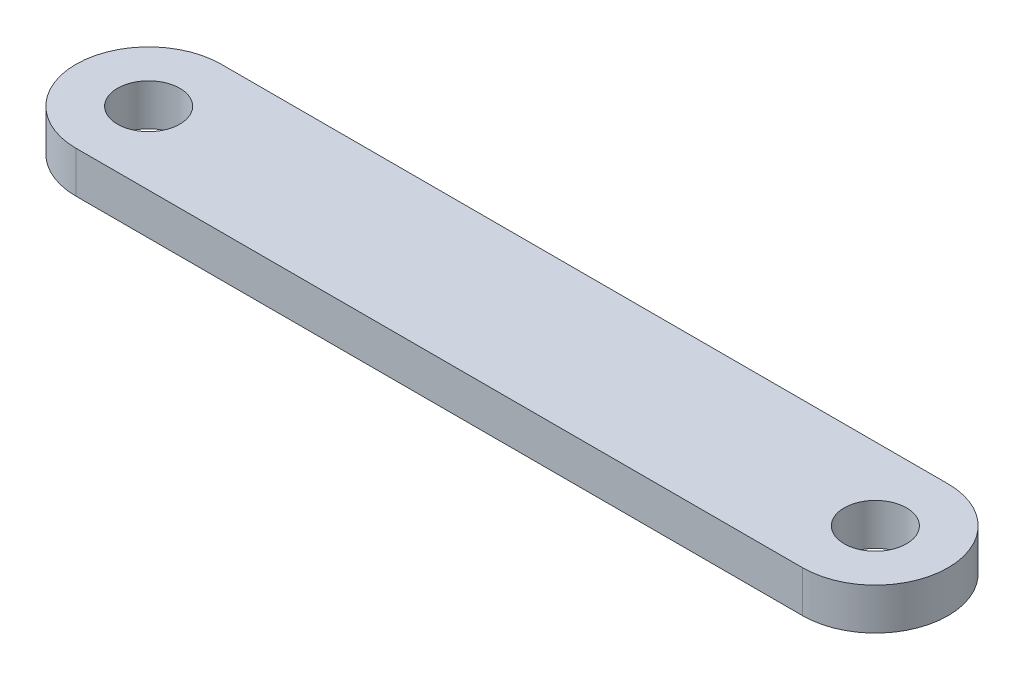
ISO-10303-21;
HEADER;
FILE_DESCRIPTION(('STEP AP214'),'2;1');
FILE_NAME('part.step','',(''),(''),'','','');
FILE_SCHEMA(('AUTOMOTIVE_DESIGN { 1 0 10303 214 1 1 1 1 }'));
ENDSEC;
DATA;
#1=APPLICATION_CONTEXT('core data for automotive mechanical design processes');
#2=APPLICATION_PROTOCOL_DEFINITION('international standard','automotive_design',2000,#1);
#3=PRODUCT_CONTEXT('',#1,'mechanical');
#4=PRODUCT('Part','Part','',(#3));
#5=PRODUCT_RELATED_PRODUCT_CATEGORY('part','',(#4));
#6=PRODUCT_DEFINITION_FORMATION('','',#4);
#7=PRODUCT_DEFINITION_CONTEXT('part definition',#1,'design');
#8=PRODUCT_DEFINITION('design','',#6,#7);
#9=PRODUCT_DEFINITION_SHAPE('','',#8);
#10=(LENGTH_UNIT() NAMED_UNIT(*) SI_UNIT(.MILLI.,.METRE.));
#11=(NAMED_UNIT(*) PLANE_ANGLE_UNIT() SI_UNIT($,.RADIAN.));
#12=(NAMED_UNIT(*) SI_UNIT($,.STERADIAN.) SOLID_ANGLE_UNIT());
#13=UNCERTAINTY_MEASURE_WITH_UNIT(LENGTH_MEASURE(1.E-05),#10,'distance_accuracy_value','');
#14=(GEOMETRIC_REPRESENTATION_CONTEXT(3) GLOBAL_UNCERTAINTY_ASSIGNED_CONTEXT((#13)) GLOBAL_UNIT_ASSIGNED_CONTEXT((#10,
#11,#12)) REPRESENTATION_CONTEXT('',''));
#15=CARTESIAN_POINT('',(0.,0.,0.));
#16=DIRECTION('',(0.,0.,1.));
#17=DIRECTION('',(1.,0.,0.));
#18=AXIS2_PLACEMENT_3D('',#15,#16,#17);
#19=CARTESIAN_POINT('',(17.495,2.,0.));
#20=DIRECTION('',(0.,1.,0.));
#21=DIRECTION('',(0.,0.,1.));
#22=AXIS2_PLACEMENT_3D('',#19,#20,#21);
#23=PLANE('',#22);
#24=CARTESIAN_POINT('',(-17.495,2.,0.));
#25=DIRECTION('',(0.,1.,0.));
#26=DIRECTION('',(0.,0.,1.));
#27=AXIS2_PLACEMENT_3D('',#24,#25,#26);
#28=CIRCLE('',#27,1.5);
#29=CARTESIAN_POINT('',(-17.495,2.,1.5));
#30=VERTEX_POINT('',#29);
#31=EDGE_CURVE('E102',#30,#30,#28,.T.);
#32=ORIENTED_EDGE('',*,*,#31,.F.);
#33=EDGE_LOOP('',(#32));
#34=FACE_BOUND('',#33,.T.);
#35=CARTESIAN_POINT('',(17.495,2.,0.));
#36=DIRECTION('',(0.,1.,0.));
#37=DIRECTION('',(0.,0.,1.));
#38=AXIS2_PLACEMENT_3D('',#35,#36,#37);
#39=CIRCLE('',#38,3.5);
#40=CARTESIAN_POINT('',(17.495,2.,3.49999999999999));
#41=VERTEX_POINT('',#40);
#42=CARTESIAN_POINT('',(17.495,2.,-3.50000000000001));
#43=VERTEX_POINT('',#42);
#44=EDGE_CURVE('E87',#41,#43,#39,.T.);
#45=ORIENTED_EDGE('',*,*,#44,.T.);
#46=DIRECTION('',(-1.,0.,0.));
#47=VECTOR('',#46,1.);
#48=CARTESIAN_POINT('',(17.495,2.,-3.50000000000001));
#49=LINE('',#48,#47);
#50=CARTESIAN_POINT('',(-17.495,2.,-3.5));
#51=VERTEX_POINT('',#50);
#52=EDGE_CURVE('E82',#43,#51,#49,.T.);
#53=ORIENTED_EDGE('',*,*,#52,.T.);
#54=CARTESIAN_POINT('',(-17.495,2.,0.));
#55=DIRECTION('',(0.,1.,0.));
#56=DIRECTION('',(0.,0.,1.));
#57=AXIS2_PLACEMENT_3D('',#54,#55,#56);
#58=CIRCLE('',#57,3.5);
#59=CARTESIAN_POINT('',(-17.495,2.,3.50000000000001));
#60=VERTEX_POINT('',#59);
#61=EDGE_CURVE('E85',#51,#60,#58,.T.);
#62=ORIENTED_EDGE('',*,*,#61,.T.);
#63=DIRECTION('',(1.,0.,0.));
#64=VECTOR('',#63,1.);
#65=CARTESIAN_POINT('',(17.495,2.,3.49999999999999));
#66=LINE('',#65,#64);
#67=EDGE_CURVE('E52',#60,#41,#66,.T.);
#68=ORIENTED_EDGE('',*,*,#67,.T.);
#69=EDGE_LOOP('',(#45,#53,#62,#68));
#70=FACE_BOUND('',#69,.T.);
#71=CARTESIAN_POINT('',(17.495,2.,0.));
#72=DIRECTION('',(0.,1.,0.));
#73=DIRECTION('',(0.,0.,1.));
#74=AXIS2_PLACEMENT_3D('',#71,#72,#73);
#75=CIRCLE('',#74,1.5);
#76=CARTESIAN_POINT('',(17.495,2.,1.5));
#77=VERTEX_POINT('',#76);
#78=EDGE_CURVE('E117',#77,#77,#75,.T.);
#79=ORIENTED_EDGE('',*,*,#78,.F.);
#80=EDGE_LOOP('',(#79));
#81=FACE_BOUND('',#80,.T.);
#82=ADVANCED_FACE('F35',(#34,#70,#81),#23,.T.);
#83=CARTESIAN_POINT('',(17.495,0.,0.));
#84=DIRECTION('',(0.,1.,0.));
#85=DIRECTION('',(0.,0.,1.));
#86=AXIS2_PLACEMENT_3D('',#83,#84,#85);
#87=PLANE('',#86);
#88=CARTESIAN_POINT('',(17.495,0.,0.));
#89=DIRECTION('',(0.,1.,0.));
#90=DIRECTION('',(0.,0.,1.));
#91=AXIS2_PLACEMENT_3D('',#88,#89,#90);
#92=CIRCLE('',#91,3.5);
#93=CARTESIAN_POINT('',(17.495,0.,3.49999999999999));
#94=VERTEX_POINT('',#93);
#95=CARTESIAN_POINT('',(17.495,0.,-3.50000000000001));
#96=VERTEX_POINT('',#95);
#97=EDGE_CURVE('E99',#94,#96,#92,.T.);
#98=ORIENTED_EDGE('',*,*,#97,.F.);
#99=DIRECTION('',(1.,0.,0.));
#100=VECTOR('',#99,1.);
#101=CARTESIAN_POINT('',(17.495,0.,3.49999999999999));
#102=LINE('',#101,#100);
#103=CARTESIAN_POINT('',(-17.495,0.,3.50000000000001));
#104=VERTEX_POINT('',#103);
#105=EDGE_CURVE('E75',#104,#94,#102,.T.);
#106=ORIENTED_EDGE('',*,*,#105,.F.);
#107=CARTESIAN_POINT('',(-17.495,0.,0.));
#108=DIRECTION('',(0.,1.,0.));
#109=DIRECTION('',(0.,0.,1.));
#110=AXIS2_PLACEMENT_3D('',#107,#108,#109);
#111=CIRCLE('',#110,3.5);
#112=CARTESIAN_POINT('',(-17.495,0.,-3.5));
#113=VERTEX_POINT('',#112);
#114=EDGE_CURVE('E69',#113,#104,#111,.T.);
#115=ORIENTED_EDGE('',*,*,#114,.F.);
#116=DIRECTION('',(-1.,0.,0.));
#117=VECTOR('',#116,1.);
#118=CARTESIAN_POINT('',(17.495,0.,-3.50000000000001));
#119=LINE('',#118,#117);
#120=EDGE_CURVE('E91',#96,#113,#119,.T.);
#121=ORIENTED_EDGE('',*,*,#120,.F.);
#122=EDGE_LOOP('',(#98,#106,#115,#121));
#123=FACE_BOUND('',#122,.T.);
#124=CARTESIAN_POINT('',(-17.495,0.,0.));
#125=DIRECTION('',(0.,1.,0.));
#126=DIRECTION('',(0.,0.,1.));
#127=AXIS2_PLACEMENT_3D('',#124,#125,#126);
#128=CIRCLE('',#127,1.5);
#129=CARTESIAN_POINT('',(-17.495,0.,1.5));
#130=VERTEX_POINT('',#129);
#131=EDGE_CURVE('E114',#130,#130,#128,.T.);
#132=ORIENTED_EDGE('',*,*,#131,.T.);
#133=EDGE_LOOP('',(#132));
#134=FACE_BOUND('',#133,.T.);
#135=CARTESIAN_POINT('',(17.495,0.,0.));
#136=DIRECTION('',(0.,1.,0.));
#137=DIRECTION('',(0.,0.,1.));
#138=AXIS2_PLACEMENT_3D('',#135,#136,#137);
#139=CIRCLE('',#138,1.5);
#140=CARTESIAN_POINT('',(17.495,0.,1.5));
#141=VERTEX_POINT('',#140);
#142=EDGE_CURVE('E120',#141,#141,#139,.T.);
#143=ORIENTED_EDGE('',*,*,#142,.T.);
#144=EDGE_LOOP('',(#143));
#145=FACE_BOUND('',#144,.T.);
#146=ADVANCED_FACE('F110',(#123,#134,#145),#87,.F.);
#147=CARTESIAN_POINT('',(17.495,2.,0.));
#148=DIRECTION('',(0.,-1.,0.));
#149=DIRECTION('',(0.,0.,-1.));
#150=AXIS2_PLACEMENT_3D('',#147,#148,#149);
#151=CYLINDRICAL_SURFACE('',#150,3.5);
#152=ORIENTED_EDGE('',*,*,#97,.T.);
#153=DIRECTION('',(0.,-1.,0.));
#154=VECTOR('',#153,1.);
#155=CARTESIAN_POINT('',(17.495,2.,-3.50000000000001));
#156=LINE('',#155,#154);
#157=EDGE_CURVE('E11',#43,#96,#156,.T.);
#158=ORIENTED_EDGE('',*,*,#157,.F.);
#159=ORIENTED_EDGE('',*,*,#44,.F.);
#160=DIRECTION('',(0.,-1.,0.));
#161=VECTOR('',#160,1.);
#162=CARTESIAN_POINT('',(17.495,2.,3.49999999999999));
#163=LINE('',#162,#161);
#164=EDGE_CURVE('E95',#41,#94,#163,.T.);
#165=ORIENTED_EDGE('',*,*,#164,.T.);
#166=EDGE_LOOP('',(#152,#158,#159,#165));
#167=FACE_BOUND('',#166,.T.);
#168=ADVANCED_FACE('F37',(#167),#151,.T.);
#169=CARTESIAN_POINT('',(17.495,2.,-3.50000000000001));
#170=DIRECTION('',(0.,0.,1.));
#171=DIRECTION('',(1.,0.,0.));
#172=AXIS2_PLACEMENT_3D('',#169,#170,#171);
#173=PLANE('',#172);
#174=ORIENTED_EDGE('',*,*,#120,.T.);
#175=DIRECTION('',(0.,-1.,0.));
#176=VECTOR('',#175,1.);
#177=CARTESIAN_POINT('',(-17.495,2.,-3.5));
#178=LINE('',#177,#176);
#179=EDGE_CURVE('E44',#51,#113,#178,.T.);
#180=ORIENTED_EDGE('',*,*,#179,.F.);
#181=ORIENTED_EDGE('',*,*,#52,.F.);
#182=ORIENTED_EDGE('',*,*,#157,.T.);
#183=EDGE_LOOP('',(#174,#180,#181,#182));
#184=FACE_BOUND('',#183,.T.);
#185=ADVANCED_FACE('F90',(#184),#173,.F.);
#186=CARTESIAN_POINT('',(-17.495,2.,0.));
#187=DIRECTION('',(0.,-1.,0.));
#188=DIRECTION('',(0.,0.,-1.));
#189=AXIS2_PLACEMENT_3D('',#186,#187,#188);
#190=CYLINDRICAL_SURFACE('',#189,3.5);
#191=ORIENTED_EDGE('',*,*,#114,.T.);
#192=DIRECTION('',(0.,-1.,0.));
#193=VECTOR('',#192,1.);
#194=CARTESIAN_POINT('',(-17.495,2.,3.50000000000001));
#195=LINE('',#194,#193);
#196=EDGE_CURVE('E92',#60,#104,#195,.T.);
#197=ORIENTED_EDGE('',*,*,#196,.F.);
#198=ORIENTED_EDGE('',*,*,#61,.F.);
#199=ORIENTED_EDGE('',*,*,#179,.T.);
#200=EDGE_LOOP('',(#191,#197,#198,#199));
#201=FACE_BOUND('',#200,.T.);
#202=ADVANCED_FACE('F93',(#201),#190,.T.);
#203=CARTESIAN_POINT('',(17.495,2.,3.49999999999999));
#204=DIRECTION('',(0.,0.,-1.));
#205=DIRECTION('',(-1.,0.,0.));
#206=AXIS2_PLACEMENT_3D('',#203,#204,#205);
#207=PLANE('',#206);
#208=ORIENTED_EDGE('',*,*,#105,.T.);
#209=ORIENTED_EDGE('',*,*,#164,.F.);
#210=ORIENTED_EDGE('',*,*,#67,.F.);
#211=ORIENTED_EDGE('',*,*,#196,.T.);
#212=EDGE_LOOP('',(#208,#209,#210,#211));
#213=FACE_BOUND('',#212,.T.);
#214=ADVANCED_FACE('F107',(#213),#207,.F.);
#215=CARTESIAN_POINT('',(-17.495,2.,0.));
#216=DIRECTION('',(0.,-1.,0.));
#217=DIRECTION('',(0.,0.,-1.));
#218=AXIS2_PLACEMENT_3D('',#215,#216,#217);
#219=CYLINDRICAL_SURFACE('',#218,1.5);
#220=ORIENTED_EDGE('',*,*,#31,.T.);
#221=EDGE_LOOP('',(#220));
#222=FACE_BOUND('',#221,.T.);
#223=ORIENTED_EDGE('',*,*,#131,.F.);
#224=EDGE_LOOP('',(#223));
#225=FACE_BOUND('',#224,.T.);
#226=ADVANCED_FACE('F137',(#222,#225),#219,.F.);
#227=CARTESIAN_POINT('',(17.495,2.,0.));
#228=DIRECTION('',(0.,-1.,0.));
#229=DIRECTION('',(0.,0.,-1.));
#230=AXIS2_PLACEMENT_3D('',#227,#228,#229);
#231=CYLINDRICAL_SURFACE('',#230,1.5);
#232=ORIENTED_EDGE('',*,*,#78,.T.);
#233=EDGE_LOOP('',(#232));
#234=FACE_BOUND('',#233,.T.);
#235=ORIENTED_EDGE('',*,*,#142,.F.);
#236=EDGE_LOOP('',(#235));
#237=FACE_BOUND('',#236,.T.);
#238=ADVANCED_FACE('F126',(#234,#237),#231,.F.);
#239=CLOSED_SHELL('',(#82,#146,#168,#185,#202,#214,#226,#238));
#240=MANIFOLD_SOLID_BREP('B2',#239);
#241=ADVANCED_BREP_SHAPE_REPRESENTATION('',(#18,#240),#14);
#242=SHAPE_DEFINITION_REPRESENTATION(#9,#241);
ENDSEC;
END-ISO-10303-21;
